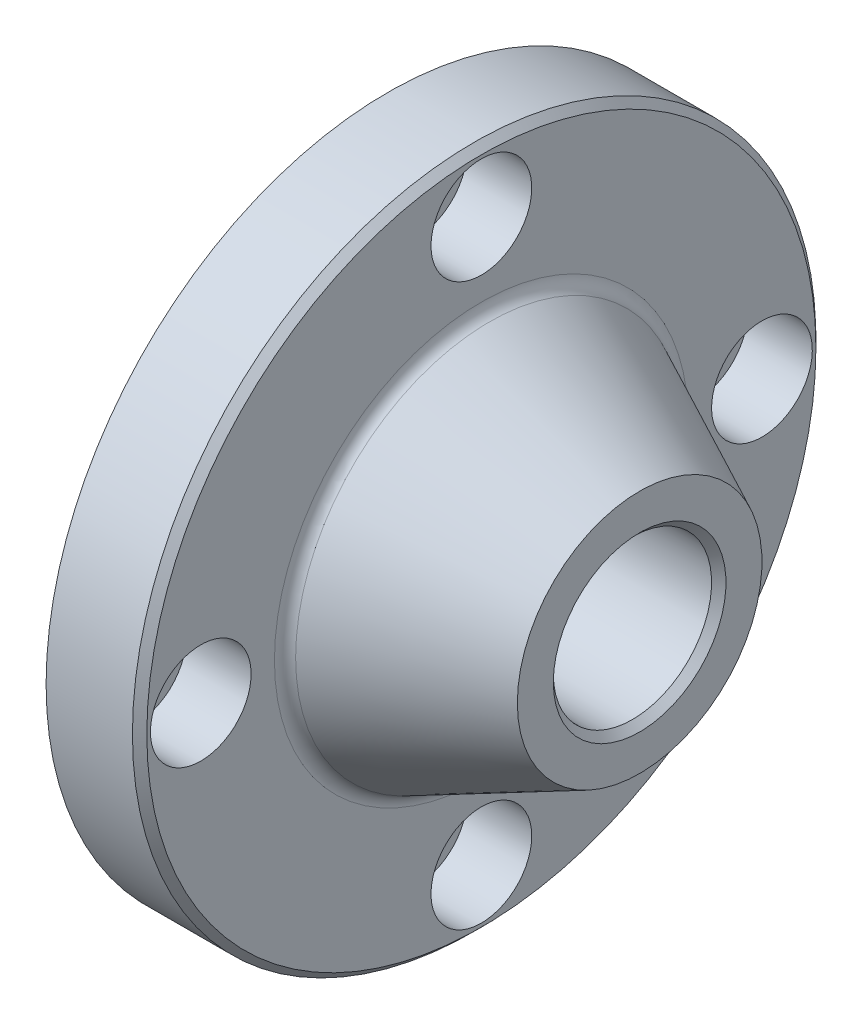
ISO-10303-21;
HEADER;
FILE_DESCRIPTION(('STEP AP214'),'2;1');
FILE_NAME('part.step','',(''),(''),'','','');
FILE_SCHEMA(('AUTOMOTIVE_DESIGN { 1 0 10303 214 1 1 1 1 }'));
ENDSEC;
DATA;
#1=APPLICATION_CONTEXT('core data for automotive mechanical design processes');
#2=APPLICATION_PROTOCOL_DEFINITION('international standard','automotive_design',2000,#1);
#3=PRODUCT_CONTEXT('',#1,'mechanical');
#4=PRODUCT('Part','Part','',(#3));
#5=PRODUCT_RELATED_PRODUCT_CATEGORY('part','',(#4));
#6=PRODUCT_DEFINITION_FORMATION('','',#4);
#7=PRODUCT_DEFINITION_CONTEXT('part definition',#1,'design');
#8=PRODUCT_DEFINITION('design','',#6,#7);
#9=PRODUCT_DEFINITION_SHAPE('','',#8);
#10=(LENGTH_UNIT() NAMED_UNIT(*) SI_UNIT(.MILLI.,.METRE.));
#11=(NAMED_UNIT(*) PLANE_ANGLE_UNIT() SI_UNIT($,.RADIAN.));
#12=(NAMED_UNIT(*) SI_UNIT($,.STERADIAN.) SOLID_ANGLE_UNIT());
#13=UNCERTAINTY_MEASURE_WITH_UNIT(LENGTH_MEASURE(1.E-05),#10,'distance_accuracy_value','');
#14=(GEOMETRIC_REPRESENTATION_CONTEXT(3) GLOBAL_UNCERTAINTY_ASSIGNED_CONTEXT((#13)) GLOBAL_UNIT_ASSIGNED_CONTEXT((#10,
#11,#12)) REPRESENTATION_CONTEXT('',''));
#15=CARTESIAN_POINT('',(0.,0.,0.));
#16=DIRECTION('',(0.,0.,1.));
#17=DIRECTION('',(1.,0.,0.));
#18=AXIS2_PLACEMENT_3D('',#15,#16,#17);
#19=CARTESIAN_POINT('',(0.,0.,0.));
#20=DIRECTION('',(-1.,0.,0.));
#21=DIRECTION('',(0.,0.,1.));
#22=AXIS2_PLACEMENT_3D('',#19,#20,#21);
#23=CYLINDRICAL_SURFACE('',#22,31.);
#24=CARTESIAN_POINT('',(1.00000000000003,0.,0.));
#25=DIRECTION('',(1.,0.,0.));
#26=DIRECTION('',(0.,0.,-1.));
#27=AXIS2_PLACEMENT_3D('',#24,#25,#26);
#28=CIRCLE('',#27,31.);
#29=CARTESIAN_POINT('',(1.00000000000003,0.,-31.));
#30=VERTEX_POINT('',#29);
#31=EDGE_CURVE('E123',#30,#30,#28,.T.);
#32=ORIENTED_EDGE('',*,*,#31,.T.);
#33=EDGE_LOOP('',(#32));
#34=FACE_BOUND('',#33,.T.);
#35=CARTESIAN_POINT('',(10.,0.,0.));
#36=DIRECTION('',(-1.,0.,0.));
#37=DIRECTION('',(0.,0.,1.));
#38=AXIS2_PLACEMENT_3D('',#35,#36,#37);
#39=CIRCLE('',#38,31.);
#40=CARTESIAN_POINT('',(10.,0.,31.));
#41=VERTEX_POINT('',#40);
#42=EDGE_CURVE('E66',#41,#41,#39,.T.);
#43=ORIENTED_EDGE('',*,*,#42,.T.);
#44=EDGE_LOOP('',(#43));
#45=FACE_BOUND('',#44,.T.);
#46=ADVANCED_FACE('F45',(#34,#45),#23,.T.);
#47=CARTESIAN_POINT('',(0.,31.,0.));
#48=DIRECTION('',(1.,0.,0.));
#49=DIRECTION('',(0.,0.,-1.));
#50=AXIS2_PLACEMENT_3D('',#47,#48,#49);
#51=PLANE('',#50);
#52=CARTESIAN_POINT('',(0.,0.,0.));
#53=DIRECTION('',(1.,0.,0.));
#54=DIRECTION('',(0.,0.,-1.));
#55=AXIS2_PLACEMENT_3D('',#52,#53,#54);
#56=CIRCLE('',#55,30.);
#57=CARTESIAN_POINT('',(0.,0.,-30.));
#58=VERTEX_POINT('',#57);
#59=EDGE_CURVE('E119',#58,#58,#56,.F.);
#60=ORIENTED_EDGE('',*,*,#59,.T.);
#61=EDGE_LOOP('',(#60));
#62=FACE_BOUND('',#61,.T.);
#63=CARTESIAN_POINT('',(0.,0.,0.));
#64=DIRECTION('',(-1.,0.,0.));
#65=DIRECTION('',(0.,0.,1.));
#66=AXIS2_PLACEMENT_3D('',#63,#64,#65);
#67=CIRCLE('',#66,22.5);
#68=CARTESIAN_POINT('',(0.,0.,22.5));
#69=VERTEX_POINT('',#68);
#70=EDGE_CURVE('E107',#69,#69,#67,.T.);
#71=ORIENTED_EDGE('',*,*,#70,.F.);
#72=EDGE_LOOP('',(#71));
#73=FACE_BOUND('',#72,.T.);
#74=ADVANCED_FACE('F164',(#62,#73),#51,.F.);
#75=CARTESIAN_POINT('',(0.,0.,0.));
#76=DIRECTION('',(-1.,0.,0.));
#77=DIRECTION('',(0.,0.,1.));
#78=AXIS2_PLACEMENT_3D('',#75,#76,#77);
#79=CYLINDRICAL_SURFACE('',#78,22.5);
#80=CARTESIAN_POINT('',(15.,0.,0.));
#81=DIRECTION('',(-1.,0.,0.));
#82=DIRECTION('',(0.,0.,1.));
#83=AXIS2_PLACEMENT_3D('',#80,#81,#82);
#84=CIRCLE('',#83,22.5);
#85=CARTESIAN_POINT('',(15.,0.,22.5));
#86=VERTEX_POINT('',#85);
#87=EDGE_CURVE('E103',#86,#86,#84,.T.);
#88=ORIENTED_EDGE('',*,*,#87,.F.);
#89=EDGE_LOOP('',(#88));
#90=FACE_BOUND('',#89,.T.);
#91=ORIENTED_EDGE('',*,*,#70,.T.);
#92=EDGE_LOOP('',(#91));
#93=FACE_BOUND('',#92,.T.);
#94=ADVANCED_FACE('F170',(#90,#93),#79,.F.);
#95=CARTESIAN_POINT('',(15.,22.5,0.));
#96=DIRECTION('',(1.,0.,0.));
#97=DIRECTION('',(0.,0.,-1.));
#98=AXIS2_PLACEMENT_3D('',#95,#96,#97);
#99=PLANE('',#98);
#100=CARTESIAN_POINT('',(15.,0.,0.));
#101=DIRECTION('',(-1.,0.,0.));
#102=DIRECTION('',(0.,0.,1.));
#103=AXIS2_PLACEMENT_3D('',#100,#101,#102);
#104=CIRCLE('',#103,11.);
#105=CARTESIAN_POINT('',(15.,0.,11.));
#106=VERTEX_POINT('',#105);
#107=EDGE_CURVE('E99',#106,#106,#104,.T.);
#108=ORIENTED_EDGE('',*,*,#107,.F.);
#109=EDGE_LOOP('',(#108));
#110=FACE_BOUND('',#109,.T.);
#111=ORIENTED_EDGE('',*,*,#87,.T.);
#112=EDGE_LOOP('',(#111));
#113=FACE_BOUND('',#112,.T.);
#114=ADVANCED_FACE('F196',(#110,#113),#99,.F.);
#115=CARTESIAN_POINT('',(0.,0.,0.));
#116=DIRECTION('',(-1.,0.,0.));
#117=DIRECTION('',(0.,0.,1.));
#118=AXIS2_PLACEMENT_3D('',#115,#116,#117);
#119=CYLINDRICAL_SURFACE('',#118,11.);
#120=CARTESIAN_POINT('',(44.,0.,0.));
#121=DIRECTION('',(-1.,0.,0.));
#122=DIRECTION('',(0.,0.,1.));
#123=AXIS2_PLACEMENT_3D('',#120,#121,#122);
#124=CIRCLE('',#123,11.);
#125=CARTESIAN_POINT('',(44.,0.,11.));
#126=VERTEX_POINT('',#125);
#127=EDGE_CURVE('E115',#126,#126,#124,.F.);
#128=ORIENTED_EDGE('',*,*,#127,.T.);
#129=EDGE_LOOP('',(#128));
#130=FACE_BOUND('',#129,.T.);
#131=ORIENTED_EDGE('',*,*,#107,.T.);
#132=EDGE_LOOP('',(#131));
#133=FACE_BOUND('',#132,.T.);
#134=ADVANCED_FACE('F201',(#130,#133),#119,.F.);
#135=CARTESIAN_POINT('',(45.,11.,0.));
#136=DIRECTION('',(-1.,0.,0.));
#137=DIRECTION('',(0.,0.,1.));
#138=AXIS2_PLACEMENT_3D('',#135,#136,#137);
#139=PLANE('',#138);
#140=CARTESIAN_POINT('',(45.,0.,0.));
#141=DIRECTION('',(-1.,0.,0.));
#142=DIRECTION('',(0.,0.,1.));
#143=AXIS2_PLACEMENT_3D('',#140,#141,#142);
#144=CIRCLE('',#143,12.);
#145=CARTESIAN_POINT('',(45.,0.,12.));
#146=VERTEX_POINT('',#145);
#147=EDGE_CURVE('E111',#146,#146,#144,.T.);
#148=ORIENTED_EDGE('',*,*,#147,.T.);
#149=EDGE_LOOP('',(#148));
#150=FACE_BOUND('',#149,.T.);
#151=CARTESIAN_POINT('',(45.,0.,0.));
#152=DIRECTION('',(-1.,0.,0.));
#153=DIRECTION('',(0.,0.,1.));
#154=AXIS2_PLACEMENT_3D('',#151,#152,#153);
#155=CIRCLE('',#154,17.);
#156=CARTESIAN_POINT('',(45.,0.,17.));
#157=VERTEX_POINT('',#156);
#158=EDGE_CURVE('E95',#157,#157,#155,.T.);
#159=ORIENTED_EDGE('',*,*,#158,.F.);
#160=EDGE_LOOP('',(#159));
#161=FACE_BOUND('',#160,.T.);
#162=ADVANCED_FACE('F208',(#150,#161),#139,.F.);
#163=CARTESIAN_POINT('',(45.,0.,0.));
#164=DIRECTION('',(-1.,0.,0.));
#165=DIRECTION('',(0.,0.,1.));
#166=AXIS2_PLACEMENT_3D('',#163,#164,#165);
#167=CONICAL_SURFACE('',#166,17.,0.445301043887686);
#168=CARTESIAN_POINT('',(24.1385408275701,0.,0.));
#169=DIRECTION('',(-1.,0.,0.));
#170=DIRECTION('',(0.,0.,1.));
#171=AXIS2_PLACEMENT_3D('',#168,#169,#170);
#172=CIRCLE('',#171,26.9566055141143);
#173=CARTESIAN_POINT('',(24.1385408275701,0.,26.9566055141143));
#174=VERTEX_POINT('',#173);
#175=EDGE_CURVE('E10',#174,#174,#172,.F.);
#176=ORIENTED_EDGE('',*,*,#175,.T.);
#177=EDGE_LOOP('',(#176));
#178=FACE_BOUND('',#177,.T.);
#179=ORIENTED_EDGE('',*,*,#158,.T.);
#180=EDGE_LOOP('',(#179));
#181=FACE_BOUND('',#180,.T.);
#182=ADVANCED_FACE('F212',(#178,#181),#167,.T.);
#183=CARTESIAN_POINT('',(23.,27.5,0.));
#184=DIRECTION('',(-1.,0.,0.));
#185=DIRECTION('',(0.,0.,1.));
#186=AXIS2_PLACEMENT_3D('',#183,#184,#185);
#187=PLANE('',#186);
#188=CARTESIAN_POINT('',(23.,-1.36167772214882E-13,-39.));
#189=DIRECTION('',(-1.,0.,0.));
#190=DIRECTION('',(0.,1.,0.));
#191=AXIS2_PLACEMENT_3D('',#188,#189,#190);
#192=CIRCLE('',#191,7.);
#193=CARTESIAN_POINT('',(23.,6.99999999999986,-39.));
#194=VERTEX_POINT('',#193);
#195=EDGE_CURVE('E223',#194,#194,#192,.T.);
#196=ORIENTED_EDGE('',*,*,#195,.T.);
#197=EDGE_LOOP('',(#196));
#198=FACE_BOUND('',#197,.T.);
#199=CARTESIAN_POINT('',(23.,-39.,0.));
#200=DIRECTION('',(-1.,0.,0.));
#201=DIRECTION('',(0.,0.,-1.));
#202=AXIS2_PLACEMENT_3D('',#199,#200,#201);
#203=CIRCLE('',#202,7.);
#204=CARTESIAN_POINT('',(23.,-39.,-7.));
#205=VERTEX_POINT('',#204);
#206=EDGE_CURVE('E227',#205,#205,#203,.T.);
#207=ORIENTED_EDGE('',*,*,#206,.T.);
#208=EDGE_LOOP('',(#207));
#209=FACE_BOUND('',#208,.T.);
#210=CARTESIAN_POINT('',(23.,4.08503316644647E-13,39.));
#211=DIRECTION('',(-1.,0.,0.));
#212=DIRECTION('',(0.,-1.,0.));
#213=AXIS2_PLACEMENT_3D('',#210,#211,#212);
#214=CIRCLE('',#213,7.);
#215=CARTESIAN_POINT('',(23.,-6.99999999999959,39.0000000000001));
#216=VERTEX_POINT('',#215);
#217=EDGE_CURVE('E231',#216,#216,#214,.T.);
#218=ORIENTED_EDGE('',*,*,#217,.T.);
#219=EDGE_LOOP('',(#218));
#220=FACE_BOUND('',#219,.T.);
#221=CARTESIAN_POINT('',(23.,39.,0.));
#222=DIRECTION('',(-1.,0.,0.));
#223=DIRECTION('',(0.,0.,1.));
#224=AXIS2_PLACEMENT_3D('',#221,#222,#223);
#225=CIRCLE('',#224,7.);
#226=CARTESIAN_POINT('',(23.,39.,7.));
#227=VERTEX_POINT('',#226);
#228=EDGE_CURVE('E80',#227,#227,#225,.T.);
#229=ORIENTED_EDGE('',*,*,#228,.T.);
#230=EDGE_LOOP('',(#229));
#231=FACE_BOUND('',#230,.T.);
#232=CARTESIAN_POINT('',(23.,0.,0.));
#233=DIRECTION('',(-1.,0.,0.));
#234=DIRECTION('',(0.,0.,1.));
#235=AXIS2_PLACEMENT_3D('',#232,#233,#234);
#236=CIRCLE('',#235,28.7615675896816);
#237=CARTESIAN_POINT('',(23.,0.,28.7615675896816));
#238=VERTEX_POINT('',#237);
#239=EDGE_CURVE('E54',#238,#238,#236,.T.);
#240=ORIENTED_EDGE('',*,*,#239,.T.);
#241=EDGE_LOOP('',(#240));
#242=FACE_BOUND('',#241,.T.);
#243=CARTESIAN_POINT('',(23.,0.,0.));
#244=DIRECTION('',(-1.,0.,0.));
#245=DIRECTION('',(0.,0.,1.));
#246=AXIS2_PLACEMENT_3D('',#243,#244,#245);
#247=CIRCLE('',#246,46.5);
#248=CARTESIAN_POINT('',(23.,0.,46.5));
#249=VERTEX_POINT('',#248);
#250=EDGE_CURVE('E60',#249,#249,#247,.F.);
#251=ORIENTED_EDGE('',*,*,#250,.T.);
#252=EDGE_LOOP('',(#251));
#253=FACE_BOUND('',#252,.T.);
#254=ADVANCED_FACE('F134',(#198,#209,#220,#231,#242,#253),#187,.F.);
#255=CARTESIAN_POINT('',(0.,0.,0.));
#256=DIRECTION('',(-1.,0.,0.));
#257=DIRECTION('',(0.,0.,1.));
#258=AXIS2_PLACEMENT_3D('',#255,#256,#257);
#259=CYLINDRICAL_SURFACE('',#258,47.5);
#260=CARTESIAN_POINT('',(22.,0.,0.));
#261=DIRECTION('',(-1.,0.,0.));
#262=DIRECTION('',(0.,0.,1.));
#263=AXIS2_PLACEMENT_3D('',#260,#261,#262);
#264=CIRCLE('',#263,47.5);
#265=CARTESIAN_POINT('',(22.,0.,47.5));
#266=VERTEX_POINT('',#265);
#267=EDGE_CURVE('E127',#266,#266,#264,.T.);
#268=ORIENTED_EDGE('',*,*,#267,.T.);
#269=EDGE_LOOP('',(#268));
#270=FACE_BOUND('',#269,.T.);
#271=CARTESIAN_POINT('',(10.,0.,0.));
#272=DIRECTION('',(-1.,0.,0.));
#273=DIRECTION('',(0.,0.,1.));
#274=AXIS2_PLACEMENT_3D('',#271,#272,#273);
#275=CIRCLE('',#274,47.5);
#276=CARTESIAN_POINT('',(10.,0.,47.5));
#277=VERTEX_POINT('',#276);
#278=EDGE_CURVE('E72',#277,#277,#275,.T.);
#279=ORIENTED_EDGE('',*,*,#278,.F.);
#280=EDGE_LOOP('',(#279));
#281=FACE_BOUND('',#280,.T.);
#282=ADVANCED_FACE('F142',(#270,#281),#259,.T.);
#283=CARTESIAN_POINT('',(10.,47.5,0.));
#284=DIRECTION('',(1.,0.,0.));
#285=DIRECTION('',(0.,0.,-1.));
#286=AXIS2_PLACEMENT_3D('',#283,#284,#285);
#287=PLANE('',#286);
#288=CARTESIAN_POINT('',(10.,-1.36167772214882E-13,-39.));
#289=DIRECTION('',(1.,0.,0.));
#290=DIRECTION('',(0.,-1.,0.));
#291=AXIS2_PLACEMENT_3D('',#288,#289,#290);
#292=CIRCLE('',#291,4.5);
#293=CARTESIAN_POINT('',(10.,-4.50000000000013,-39.));
#294=VERTEX_POINT('',#293);
#295=EDGE_CURVE('E86',#294,#294,#292,.T.);
#296=ORIENTED_EDGE('',*,*,#295,.T.);
#297=EDGE_LOOP('',(#296));
#298=FACE_BOUND('',#297,.T.);
#299=CARTESIAN_POINT('',(10.,-39.,0.));
#300=DIRECTION('',(1.,0.,0.));
#301=DIRECTION('',(0.,0.,1.));
#302=AXIS2_PLACEMENT_3D('',#299,#300,#301);
#303=CIRCLE('',#302,4.5);
#304=CARTESIAN_POINT('',(10.,-39.,4.5));
#305=VERTEX_POINT('',#304);
#306=EDGE_CURVE('E322',#305,#305,#303,.T.);
#307=ORIENTED_EDGE('',*,*,#306,.T.);
#308=EDGE_LOOP('',(#307));
#309=FACE_BOUND('',#308,.T.);
#310=CARTESIAN_POINT('',(10.,4.08503316644647E-13,39.));
#311=DIRECTION('',(1.,0.,0.));
#312=DIRECTION('',(0.,1.,0.));
#313=AXIS2_PLACEMENT_3D('',#310,#311,#312);
#314=CIRCLE('',#313,4.5);
#315=CARTESIAN_POINT('',(10.,4.50000000000041,38.9999999999999));
#316=VERTEX_POINT('',#315);
#317=EDGE_CURVE('E89',#316,#316,#314,.T.);
#318=ORIENTED_EDGE('',*,*,#317,.T.);
#319=EDGE_LOOP('',(#318));
#320=FACE_BOUND('',#319,.T.);
#321=CARTESIAN_POINT('',(10.,39.,0.));
#322=DIRECTION('',(1.,0.,0.));
#323=DIRECTION('',(0.,0.,-1.));
#324=AXIS2_PLACEMENT_3D('',#321,#322,#323);
#325=CIRCLE('',#324,4.5);
#326=CARTESIAN_POINT('',(10.,39.,-4.5));
#327=VERTEX_POINT('',#326);
#328=EDGE_CURVE('E63',#327,#327,#325,.T.);
#329=ORIENTED_EDGE('',*,*,#328,.T.);
#330=EDGE_LOOP('',(#329));
#331=FACE_BOUND('',#330,.T.);
#332=ORIENTED_EDGE('',*,*,#42,.F.);
#333=EDGE_LOOP('',(#332));
#334=FACE_BOUND('',#333,.T.);
#335=ORIENTED_EDGE('',*,*,#278,.T.);
#336=EDGE_LOOP('',(#335));
#337=FACE_BOUND('',#336,.T.);
#338=ADVANCED_FACE('F145',(#298,#309,#320,#331,#334,#337),#287,.F.);
#339=CARTESIAN_POINT('',(45.,0.,0.));
#340=DIRECTION('',(1.,0.,0.));
#341=DIRECTION('',(0.,0.,-1.));
#342=AXIS2_PLACEMENT_3D('',#339,#340,#341);
#343=CONICAL_SURFACE('',#342,12.,0.785398163397447);
#344=ORIENTED_EDGE('',*,*,#127,.F.);
#345=EDGE_LOOP('',(#344));
#346=FACE_BOUND('',#345,.T.);
#347=ORIENTED_EDGE('',*,*,#147,.F.);
#348=EDGE_LOOP('',(#347));
#349=FACE_BOUND('',#348,.T.);
#350=ADVANCED_FACE('F150',(#346,#349),#343,.F.);
#351=CARTESIAN_POINT('',(0.,0.,0.));
#352=DIRECTION('',(1.,0.,0.));
#353=DIRECTION('',(0.,0.,-1.));
#354=AXIS2_PLACEMENT_3D('',#351,#352,#353);
#355=CONICAL_SURFACE('',#354,30.,0.785398163397443);
#356=ORIENTED_EDGE('',*,*,#31,.F.);
#357=EDGE_LOOP('',(#356));
#358=FACE_BOUND('',#357,.T.);
#359=ORIENTED_EDGE('',*,*,#59,.F.);
#360=EDGE_LOOP('',(#359));
#361=FACE_BOUND('',#360,.T.);
#362=ADVANCED_FACE('F139',(#358,#361),#355,.T.);
#363=CARTESIAN_POINT('',(22.,0.,0.));
#364=DIRECTION('',(-1.,0.,0.));
#365=DIRECTION('',(0.,0.,1.));
#366=AXIS2_PLACEMENT_3D('',#363,#364,#365);
#367=CONICAL_SURFACE('',#366,47.5,0.785398163397452);
#368=ORIENTED_EDGE('',*,*,#250,.F.);
#369=EDGE_LOOP('',(#368));
#370=FACE_BOUND('',#369,.T.);
#371=ORIENTED_EDGE('',*,*,#267,.F.);
#372=EDGE_LOOP('',(#371));
#373=FACE_BOUND('',#372,.T.);
#374=ADVANCED_FACE('F136',(#370,#373),#367,.T.);
#375=CARTESIAN_POINT('',(25.,0.,0.));
#376=DIRECTION('',(-1.,0.,0.));
#377=DIRECTION('',(0.,0.,1.));
#378=AXIS2_PLACEMENT_3D('',#375,#376,#377);
#379=TOROIDAL_SURFACE('',#378,28.7615675896816,2.);
#380=ORIENTED_EDGE('',*,*,#175,.F.);
#381=EDGE_LOOP('',(#380));
#382=FACE_BOUND('',#381,.T.);
#383=ORIENTED_EDGE('',*,*,#239,.F.);
#384=EDGE_LOOP('',(#383));
#385=FACE_BOUND('',#384,.T.);
#386=ADVANCED_FACE('F47',(#382,#385),#379,.F.);
#387=CARTESIAN_POINT('',(0.,39.,0.));
#388=DIRECTION('',(1.,0.,0.));
#389=DIRECTION('',(0.,0.,-1.));
#390=AXIS2_PLACEMENT_3D('',#387,#388,#389);
#391=CYLINDRICAL_SURFACE('',#390,4.5);
#392=CARTESIAN_POINT('',(14.,39.,0.));
#393=DIRECTION('',(-1.,0.,0.));
#394=DIRECTION('',(0.,0.,1.));
#395=AXIS2_PLACEMENT_3D('',#392,#393,#394);
#396=CIRCLE('',#395,4.5);
#397=CARTESIAN_POINT('',(14.,39.,4.5));
#398=VERTEX_POINT('',#397);
#399=EDGE_CURVE('E49',#398,#398,#396,.F.);
#400=ORIENTED_EDGE('',*,*,#399,.T.);
#401=EDGE_LOOP('',(#400));
#402=FACE_BOUND('',#401,.T.);
#403=ORIENTED_EDGE('',*,*,#328,.F.);
#404=EDGE_LOOP('',(#403));
#405=FACE_BOUND('',#404,.T.);
#406=ADVANCED_FACE('F237',(#402,#405),#391,.F.);
#407=CARTESIAN_POINT('',(14.,39.,0.));
#408=DIRECTION('',(-1.,0.,0.));
#409=DIRECTION('',(0.,0.,1.));
#410=AXIS2_PLACEMENT_3D('',#407,#408,#409);
#411=PLANE('',#410);
#412=CARTESIAN_POINT('',(14.,39.,0.));
#413=DIRECTION('',(-1.,0.,0.));
#414=DIRECTION('',(0.,0.,1.));
#415=AXIS2_PLACEMENT_3D('',#412,#413,#414);
#416=CIRCLE('',#415,7.);
#417=CARTESIAN_POINT('',(14.,39.,7.));
#418=VERTEX_POINT('',#417);
#419=EDGE_CURVE('E75',#418,#418,#416,.T.);
#420=ORIENTED_EDGE('',*,*,#419,.F.);
#421=EDGE_LOOP('',(#420));
#422=FACE_BOUND('',#421,.T.);
#423=ORIENTED_EDGE('',*,*,#399,.F.);
#424=EDGE_LOOP('',(#423));
#425=FACE_BOUND('',#424,.T.);
#426=ADVANCED_FACE('F242',(#422,#425),#411,.F.);
#427=CARTESIAN_POINT('',(14.,39.,0.));
#428=DIRECTION('',(1.,0.,0.));
#429=DIRECTION('',(0.,0.,-1.));
#430=AXIS2_PLACEMENT_3D('',#427,#428,#429);
#431=CYLINDRICAL_SURFACE('',#430,7.);
#432=ORIENTED_EDGE('',*,*,#419,.T.);
#433=EDGE_LOOP('',(#432));
#434=FACE_BOUND('',#433,.T.);
#435=ORIENTED_EDGE('',*,*,#228,.F.);
#436=EDGE_LOOP('',(#435));
#437=FACE_BOUND('',#436,.T.);
#438=ADVANCED_FACE('F246',(#434,#437),#431,.F.);
#439=CARTESIAN_POINT('',(0.,4.08503316644647E-13,39.));
#440=DIRECTION('',(1.,0.,0.));
#441=DIRECTION('',(0.,1.,0.));
#442=AXIS2_PLACEMENT_3D('',#439,#440,#441);
#443=CYLINDRICAL_SURFACE('',#442,4.5);
#444=CARTESIAN_POINT('',(14.,4.08503316644647E-13,39.));
#445=DIRECTION('',(-1.,0.,0.));
#446=DIRECTION('',(0.,0.,1.));
#447=AXIS2_PLACEMENT_3D('',#444,#445,#446);
#448=CIRCLE('',#447,4.5);
#449=CARTESIAN_POINT('',(14.,4.08503316644647E-13,43.5));
#450=VERTEX_POINT('',#449);
#451=EDGE_CURVE('E317',#450,#450,#448,.F.);
#452=ORIENTED_EDGE('',*,*,#451,.T.);
#453=EDGE_LOOP('',(#452));
#454=FACE_BOUND('',#453,.T.);
#455=ORIENTED_EDGE('',*,*,#317,.F.);
#456=EDGE_LOOP('',(#455));
#457=FACE_BOUND('',#456,.T.);
#458=ADVANCED_FACE('F251',(#454,#457),#443,.F.);
#459=CARTESIAN_POINT('',(0.,-39.,0.));
#460=DIRECTION('',(1.,0.,0.));
#461=DIRECTION('',(0.,0.,1.));
#462=AXIS2_PLACEMENT_3D('',#459,#460,#461);
#463=CYLINDRICAL_SURFACE('',#462,4.5);
#464=CARTESIAN_POINT('',(14.,-39.,0.));
#465=DIRECTION('',(-1.,0.,0.));
#466=DIRECTION('',(0.,0.,1.));
#467=AXIS2_PLACEMENT_3D('',#464,#465,#466);
#468=CIRCLE('',#467,4.5);
#469=CARTESIAN_POINT('',(14.,-39.,4.5));
#470=VERTEX_POINT('',#469);
#471=EDGE_CURVE('E313',#470,#470,#468,.F.);
#472=ORIENTED_EDGE('',*,*,#471,.T.);
#473=EDGE_LOOP('',(#472));
#474=FACE_BOUND('',#473,.T.);
#475=ORIENTED_EDGE('',*,*,#306,.F.);
#476=EDGE_LOOP('',(#475));
#477=FACE_BOUND('',#476,.T.);
#478=ADVANCED_FACE('F254',(#474,#477),#463,.F.);
#479=CARTESIAN_POINT('',(0.,-1.36167772214882E-13,-39.));
#480=DIRECTION('',(1.,0.,0.));
#481=DIRECTION('',(0.,-1.,0.));
#482=AXIS2_PLACEMENT_3D('',#479,#480,#481);
#483=CYLINDRICAL_SURFACE('',#482,4.5);
#484=CARTESIAN_POINT('',(14.,-1.36167772214882E-13,-39.));
#485=DIRECTION('',(-1.,0.,0.));
#486=DIRECTION('',(0.,0.,1.));
#487=AXIS2_PLACEMENT_3D('',#484,#485,#486);
#488=CIRCLE('',#487,4.5);
#489=CARTESIAN_POINT('',(14.,-1.36167772214882E-13,-34.5));
#490=VERTEX_POINT('',#489);
#491=EDGE_CURVE('E297',#490,#490,#488,.F.);
#492=ORIENTED_EDGE('',*,*,#491,.T.);
#493=EDGE_LOOP('',(#492));
#494=FACE_BOUND('',#493,.T.);
#495=ORIENTED_EDGE('',*,*,#295,.F.);
#496=EDGE_LOOP('',(#495));
#497=FACE_BOUND('',#496,.T.);
#498=ADVANCED_FACE('F258',(#494,#497),#483,.F.);
#499=CARTESIAN_POINT('',(14.,-1.36167772214882E-13,-39.));
#500=DIRECTION('',(-1.,0.,0.));
#501=DIRECTION('',(0.,1.,0.));
#502=AXIS2_PLACEMENT_3D('',#499,#500,#501);
#503=PLANE('',#502);
#504=CARTESIAN_POINT('',(14.,-1.36167772214882E-13,-39.));
#505=DIRECTION('',(-1.,0.,0.));
#506=DIRECTION('',(0.,1.,0.));
#507=AXIS2_PLACEMENT_3D('',#504,#505,#506);
#508=CIRCLE('',#507,7.);
#509=CARTESIAN_POINT('',(14.,6.99999999999986,-39.));
#510=VERTEX_POINT('',#509);
#511=EDGE_CURVE('E291',#510,#510,#508,.T.);
#512=ORIENTED_EDGE('',*,*,#511,.F.);
#513=EDGE_LOOP('',(#512));
#514=FACE_BOUND('',#513,.T.);
#515=ORIENTED_EDGE('',*,*,#491,.F.);
#516=EDGE_LOOP('',(#515));
#517=FACE_BOUND('',#516,.T.);
#518=ADVANCED_FACE('F262',(#514,#517),#503,.F.);
#519=CARTESIAN_POINT('',(14.,-1.36167772214882E-13,-39.));
#520=DIRECTION('',(1.,0.,0.));
#521=DIRECTION('',(0.,-1.,0.));
#522=AXIS2_PLACEMENT_3D('',#519,#520,#521);
#523=CYLINDRICAL_SURFACE('',#522,7.);
#524=ORIENTED_EDGE('',*,*,#511,.T.);
#525=EDGE_LOOP('',(#524));
#526=FACE_BOUND('',#525,.T.);
#527=ORIENTED_EDGE('',*,*,#195,.F.);
#528=EDGE_LOOP('',(#527));
#529=FACE_BOUND('',#528,.T.);
#530=ADVANCED_FACE('F276',(#526,#529),#523,.F.);
#531=CARTESIAN_POINT('',(14.,-39.,0.));
#532=DIRECTION('',(-1.,0.,0.));
#533=DIRECTION('',(0.,0.,-1.));
#534=AXIS2_PLACEMENT_3D('',#531,#532,#533);
#535=PLANE('',#534);
#536=CARTESIAN_POINT('',(14.,-39.,0.));
#537=DIRECTION('',(-1.,0.,0.));
#538=DIRECTION('',(0.,0.,-1.));
#539=AXIS2_PLACEMENT_3D('',#536,#537,#538);
#540=CIRCLE('',#539,7.);
#541=CARTESIAN_POINT('',(14.,-39.,-7.));
#542=VERTEX_POINT('',#541);
#543=EDGE_CURVE('E293',#542,#542,#540,.T.);
#544=ORIENTED_EDGE('',*,*,#543,.F.);
#545=EDGE_LOOP('',(#544));
#546=FACE_BOUND('',#545,.T.);
#547=ORIENTED_EDGE('',*,*,#471,.F.);
#548=EDGE_LOOP('',(#547));
#549=FACE_BOUND('',#548,.T.);
#550=ADVANCED_FACE('F273',(#546,#549),#535,.F.);
#551=CARTESIAN_POINT('',(14.,-39.,0.));
#552=DIRECTION('',(1.,0.,0.));
#553=DIRECTION('',(0.,0.,1.));
#554=AXIS2_PLACEMENT_3D('',#551,#552,#553);
#555=CYLINDRICAL_SURFACE('',#554,7.);
#556=ORIENTED_EDGE('',*,*,#543,.T.);
#557=EDGE_LOOP('',(#556));
#558=FACE_BOUND('',#557,.T.);
#559=ORIENTED_EDGE('',*,*,#206,.F.);
#560=EDGE_LOOP('',(#559));
#561=FACE_BOUND('',#560,.T.);
#562=ADVANCED_FACE('F268',(#558,#561),#555,.F.);
#563=CARTESIAN_POINT('',(14.,4.08503316644647E-13,39.));
#564=DIRECTION('',(-1.,0.,0.));
#565=DIRECTION('',(0.,-1.,0.));
#566=AXIS2_PLACEMENT_3D('',#563,#564,#565);
#567=PLANE('',#566);
#568=CARTESIAN_POINT('',(14.,4.08503316644647E-13,39.));
#569=DIRECTION('',(-1.,0.,0.));
#570=DIRECTION('',(0.,-1.,0.));
#571=AXIS2_PLACEMENT_3D('',#568,#569,#570);
#572=CIRCLE('',#571,7.);
#573=CARTESIAN_POINT('',(14.,-6.99999999999959,39.0000000000001));
#574=VERTEX_POINT('',#573);
#575=EDGE_CURVE('E303',#574,#574,#572,.T.);
#576=ORIENTED_EDGE('',*,*,#575,.F.);
#577=EDGE_LOOP('',(#576));
#578=FACE_BOUND('',#577,.T.);
#579=ORIENTED_EDGE('',*,*,#451,.F.);
#580=EDGE_LOOP('',(#579));
#581=FACE_BOUND('',#580,.T.);
#582=ADVANCED_FACE('F264',(#578,#581),#567,.F.);
#583=CARTESIAN_POINT('',(14.,4.08503316644647E-13,39.));
#584=DIRECTION('',(1.,0.,0.));
#585=DIRECTION('',(0.,1.,0.));
#586=AXIS2_PLACEMENT_3D('',#583,#584,#585);
#587=CYLINDRICAL_SURFACE('',#586,7.);
#588=ORIENTED_EDGE('',*,*,#575,.T.);
#589=EDGE_LOOP('',(#588));
#590=FACE_BOUND('',#589,.T.);
#591=ORIENTED_EDGE('',*,*,#217,.F.);
#592=EDGE_LOOP('',(#591));
#593=FACE_BOUND('',#592,.T.);
#594=ADVANCED_FACE('F267',(#590,#593),#587,.F.);
#595=CLOSED_SHELL('',(#46,#74,#94,#114,#134,#162,#182,#254,#282,#338,#350,#362,#374,#386,#406,
#426,#438,#458,#478,#498,#518,#530,#550,#562,#582,#594));
#596=MANIFOLD_SOLID_BREP('B2',#595);
#597=ADVANCED_BREP_SHAPE_REPRESENTATION('',(#18,#596),#14);
#598=SHAPE_DEFINITION_REPRESENTATION(#9,#597);
ENDSEC;
END-ISO-10303-21;
